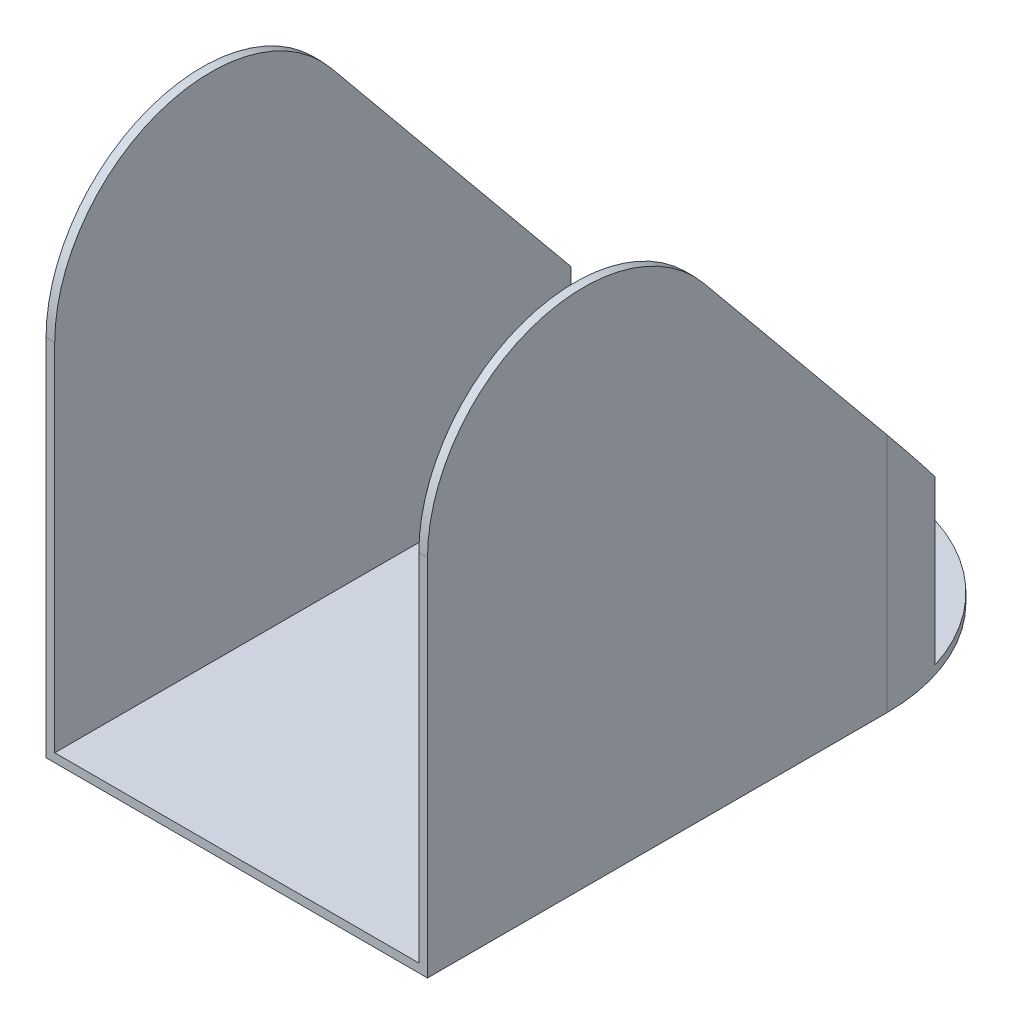
ISO-10303-21;
HEADER;
FILE_DESCRIPTION(('STEP AP214'),'2;1');
FILE_NAME('part.step','',(''),(''),'','','');
FILE_SCHEMA(('AUTOMOTIVE_DESIGN { 1 0 10303 214 1 1 1 1 }'));
ENDSEC;
DATA;
#1=APPLICATION_CONTEXT('core data for automotive mechanical design processes');
#2=APPLICATION_PROTOCOL_DEFINITION('international standard','automotive_design',2000,#1);
#3=PRODUCT_CONTEXT('',#1,'mechanical');
#4=PRODUCT('Part','Part','',(#3));
#5=PRODUCT_RELATED_PRODUCT_CATEGORY('part','',(#4));
#6=PRODUCT_DEFINITION_FORMATION('','',#4);
#7=PRODUCT_DEFINITION_CONTEXT('part definition',#1,'design');
#8=PRODUCT_DEFINITION('design','',#6,#7);
#9=PRODUCT_DEFINITION_SHAPE('','',#8);
#10=(LENGTH_UNIT() NAMED_UNIT(*) SI_UNIT(.MILLI.,.METRE.));
#11=(NAMED_UNIT(*) PLANE_ANGLE_UNIT() SI_UNIT($,.RADIAN.));
#12=(NAMED_UNIT(*) SI_UNIT($,.STERADIAN.) SOLID_ANGLE_UNIT());
#13=UNCERTAINTY_MEASURE_WITH_UNIT(LENGTH_MEASURE(1.E-05),#10,'distance_accuracy_value','');
#14=(GEOMETRIC_REPRESENTATION_CONTEXT(3) GLOBAL_UNCERTAINTY_ASSIGNED_CONTEXT((#13)) GLOBAL_UNIT_ASSIGNED_CONTEXT((#10,
#11,#12)) REPRESENTATION_CONTEXT('',''));
#15=CARTESIAN_POINT('',(0.,0.,0.));
#16=DIRECTION('',(0.,0.,1.));
#17=DIRECTION('',(1.,0.,0.));
#18=AXIS2_PLACEMENT_3D('',#15,#16,#17);
#19=CARTESIAN_POINT('',(-21.,-29.,75.));
#20=DIRECTION('',(0.,-1.,0.));
#21=DIRECTION('',(0.,0.,-1.));
#22=AXIS2_PLACEMENT_3D('',#19,#20,#21);
#23=PLANE('',#22);
#24=CARTESIAN_POINT('',(0.,-29.,22.));
#25=DIRECTION('',(0.,-1.,0.));
#26=DIRECTION('',(0.,0.,-1.));
#27=AXIS2_PLACEMENT_3D('',#24,#25,#26);
#28=CIRCLE('',#27,22.);
#29=CARTESIAN_POINT('',(-21.,-29.,15.442561475698));
#30=VERTEX_POINT('',#29);
#31=CARTESIAN_POINT('',(21.,-29.,15.442561475698));
#32=VERTEX_POINT('',#31);
#33=EDGE_CURVE('E255',#30,#32,#28,.T.);
#34=ORIENTED_EDGE('',*,*,#33,.F.);
#35=DIRECTION('',(0.,0.,-1.));
#36=VECTOR('',#35,1.);
#37=CARTESIAN_POINT('',(-21.,-29.,75.));
#38=LINE('',#37,#36);
#39=CARTESIAN_POINT('',(-21.,-29.,75.));
#40=VERTEX_POINT('',#39);
#41=EDGE_CURVE('E160',#40,#30,#38,.T.);
#42=ORIENTED_EDGE('',*,*,#41,.F.);
#43=DIRECTION('',(-1.,0.,0.));
#44=VECTOR('',#43,1.);
#45=CARTESIAN_POINT('',(-21.,-29.,75.));
#46=LINE('',#45,#44);
#47=CARTESIAN_POINT('',(21.,-29.,75.));
#48=VERTEX_POINT('',#47);
#49=EDGE_CURVE('E212',#48,#40,#46,.T.);
#50=ORIENTED_EDGE('',*,*,#49,.F.);
#51=DIRECTION('',(0.,0.,-1.));
#52=VECTOR('',#51,1.);
#53=CARTESIAN_POINT('',(21.,-29.,75.));
#54=LINE('',#53,#52);
#55=EDGE_CURVE('E166',#48,#32,#54,.T.);
#56=ORIENTED_EDGE('',*,*,#55,.T.);
#57=EDGE_LOOP('',(#34,#42,#50,#56));
#58=FACE_BOUND('',#57,.T.);
#59=ADVANCED_FACE('F59',(#58),#23,.F.);
#60=CARTESIAN_POINT('',(-22.,-30.,75.));
#61=DIRECTION('',(0.,1.,0.));
#62=DIRECTION('',(0.,0.,1.));
#63=AXIS2_PLACEMENT_3D('',#60,#61,#62);
#64=PLANE('',#63);
#65=DIRECTION('',(0.,0.,-1.));
#66=VECTOR('',#65,1.);
#67=CARTESIAN_POINT('',(-22.,-30.,75.));
#68=LINE('',#67,#66);
#69=CARTESIAN_POINT('',(-22.,-30.,75.));
#70=VERTEX_POINT('',#69);
#71=CARTESIAN_POINT('',(-22.,-30.,22.));
#72=VERTEX_POINT('',#71);
#73=EDGE_CURVE('E153',#70,#72,#68,.T.);
#74=ORIENTED_EDGE('',*,*,#73,.T.);
#75=CARTESIAN_POINT('',(0.,-30.,22.));
#76=DIRECTION('',(0.,-1.,0.));
#77=DIRECTION('',(0.,0.,-1.));
#78=AXIS2_PLACEMENT_3D('',#75,#76,#77);
#79=CIRCLE('',#78,22.);
#80=CARTESIAN_POINT('',(22.,-30.,22.));
#81=VERTEX_POINT('',#80);
#82=EDGE_CURVE('E136',#72,#81,#79,.T.);
#83=ORIENTED_EDGE('',*,*,#82,.T.);
#84=DIRECTION('',(0.,0.,-1.));
#85=VECTOR('',#84,1.);
#86=CARTESIAN_POINT('',(22.,-30.,75.));
#87=LINE('',#86,#85);
#88=CARTESIAN_POINT('',(22.,-30.,75.));
#89=VERTEX_POINT('',#88);
#90=EDGE_CURVE('E161',#89,#81,#87,.T.);
#91=ORIENTED_EDGE('',*,*,#90,.F.);
#92=DIRECTION('',(1.,0.,0.));
#93=VECTOR('',#92,1.);
#94=CARTESIAN_POINT('',(-22.,-30.,75.));
#95=LINE('',#94,#93);
#96=EDGE_CURVE('E83',#70,#89,#95,.T.);
#97=ORIENTED_EDGE('',*,*,#96,.F.);
#98=EDGE_LOOP('',(#74,#83,#91,#97));
#99=FACE_BOUND('',#98,.T.);
#100=ADVANCED_FACE('F158',(#99),#64,.F.);
#101=CARTESIAN_POINT('',(-21.,30.,75.));
#102=DIRECTION('',(-1.,0.,0.));
#103=DIRECTION('',(0.,-1.,0.));
#104=AXIS2_PLACEMENT_3D('',#101,#102,#103);
#105=PLANE('',#104);
#106=DIRECTION('',(0.,-1.,0.));
#107=VECTOR('',#106,1.);
#108=CARTESIAN_POINT('',(-21.,30.,15.442561475698));
#109=LINE('',#108,#107);
#110=CARTESIAN_POINT('',(-21.,-10.2122612272496,15.442561475698));
#111=VERTEX_POINT('',#110);
#112=EDGE_CURVE('E146',#111,#30,#109,.T.);
#113=ORIENTED_EDGE('',*,*,#112,.F.);
#114=DIRECTION('',(0.,-0.772529054392895,-0.634979417082805));
#115=VECTOR('',#114,1.);
#116=CARTESIAN_POINT('',(-21.,43.0017709008345,59.1817773785494));
#117=LINE('',#116,#115);
#118=CARTESIAN_POINT('',(-21.,23.4296295074905,43.0944770209279));
#119=VERTEX_POINT('',#118);
#120=EDGE_CURVE('E194',#119,#111,#117,.T.);
#121=ORIENTED_EDGE('',*,*,#120,.F.);
#122=CARTESIAN_POINT('',(-21.,12.,57.));
#123=DIRECTION('',(-1.,0.,0.));
#124=DIRECTION('',(0.,-1.,0.));
#125=AXIS2_PLACEMENT_3D('',#122,#123,#124);
#126=CIRCLE('',#125,18.);
#127=CARTESIAN_POINT('',(-21.,12.,75.));
#128=VERTEX_POINT('',#127);
#129=EDGE_CURVE('E193',#128,#119,#126,.T.);
#130=ORIENTED_EDGE('',*,*,#129,.F.);
#131=DIRECTION('',(0.,1.,0.));
#132=VECTOR('',#131,1.);
#133=CARTESIAN_POINT('',(-21.,30.,75.));
#134=LINE('',#133,#132);
#135=EDGE_CURVE('E215',#40,#128,#134,.T.);
#136=ORIENTED_EDGE('',*,*,#135,.F.);
#137=ORIENTED_EDGE('',*,*,#41,.T.);
#138=EDGE_LOOP('',(#113,#121,#130,#136,#137));
#139=FACE_BOUND('',#138,.T.);
#140=ADVANCED_FACE('F267',(#139),#105,.F.);
#141=CARTESIAN_POINT('',(-104.036577207975,-11.6927669434458,14.2256614105));
#142=DIRECTION('',(0.,0.634979417082805,-0.772529054392895));
#143=DIRECTION('',(0.,0.772529054392895,0.634979417082805));
#144=AXIS2_PLACEMENT_3D('',#141,#142,#143);
#145=PLANE('',#144);
#146=ORIENTED_EDGE('',*,*,#120,.T.);
#147=CARTESIAN_POINT('',(0.,-2.23434628050732,22.));
#148=DIRECTION('',(0.,0.634979417082805,-0.772529054392895));
#149=DIRECTION('',(0.,-0.772529054392895,-0.634979417082805));
#150=AXIS2_PLACEMENT_3D('',#147,#148,#149);
#151=ELLIPSE('',#150,34.6467923339491,22.);
#152=CARTESIAN_POINT('',(-22.,-2.23434628050733,22.));
#153=VERTEX_POINT('',#152);
#154=EDGE_CURVE('E12',#111,#153,#151,.T.);
#155=ORIENTED_EDGE('',*,*,#154,.T.);
#156=DIRECTION('',(0.,-0.772529054392895,-0.634979417082805));
#157=VECTOR('',#156,1.);
#158=CARTESIAN_POINT('',(-22.,-11.6927669434458,14.2256614105));
#159=LINE('',#158,#157);
#160=CARTESIAN_POINT('',(-22.,23.4296295074905,43.0944770209279));
#161=VERTEX_POINT('',#160);
#162=EDGE_CURVE('E155',#161,#153,#159,.T.);
#163=ORIENTED_EDGE('',*,*,#162,.F.);
#164=DIRECTION('',(1.,0.,0.));
#165=VECTOR('',#164,1.);
#166=CARTESIAN_POINT('',(-104.036577207975,23.4296295074905,43.0944770209279));
#167=LINE('',#166,#165);
#168=EDGE_CURVE('E231',#161,#119,#167,.T.);
#169=ORIENTED_EDGE('',*,*,#168,.T.);
#170=EDGE_LOOP('',(#146,#155,#163,#169));
#171=FACE_BOUND('',#170,.T.);
#172=ADVANCED_FACE('F268',(#171),#145,.T.);
#173=CARTESIAN_POINT('',(22.,30.,75.));
#174=DIRECTION('',(-1.,0.,0.));
#175=DIRECTION('',(0.,-1.,0.));
#176=AXIS2_PLACEMENT_3D('',#173,#174,#175);
#177=PLANE('',#176);
#178=DIRECTION('',(0.,-1.,0.));
#179=VECTOR('',#178,1.);
#180=CARTESIAN_POINT('',(22.,30.,22.));
#181=LINE('',#180,#179);
#182=CARTESIAN_POINT('',(22.,-2.23434628050733,22.));
#183=VERTEX_POINT('',#182);
#184=EDGE_CURVE('E141',#183,#81,#181,.T.);
#185=ORIENTED_EDGE('',*,*,#184,.F.);
#186=DIRECTION('',(0.,0.772529054392895,0.634979417082805));
#187=VECTOR('',#186,1.);
#188=CARTESIAN_POINT('',(22.,-11.6927669434458,14.2256614105));
#189=LINE('',#188,#187);
#190=CARTESIAN_POINT('',(22.,23.4296295074905,43.0944770209279));
#191=VERTEX_POINT('',#190);
#192=EDGE_CURVE('E185',#183,#191,#189,.T.);
#193=ORIENTED_EDGE('',*,*,#192,.T.);
#194=CARTESIAN_POINT('',(22.,12.,57.));
#195=DIRECTION('',(1.,0.,0.));
#196=DIRECTION('',(0.,0.,-1.));
#197=AXIS2_PLACEMENT_3D('',#194,#195,#196);
#198=CIRCLE('',#197,18.);
#199=CARTESIAN_POINT('',(22.,12.,75.));
#200=VERTEX_POINT('',#199);
#201=EDGE_CURVE('E235',#191,#200,#198,.T.);
#202=ORIENTED_EDGE('',*,*,#201,.T.);
#203=DIRECTION('',(0.,1.,0.));
#204=VECTOR('',#203,1.);
#205=CARTESIAN_POINT('',(22.,30.,75.));
#206=LINE('',#205,#204);
#207=EDGE_CURVE('E206',#89,#200,#206,.T.);
#208=ORIENTED_EDGE('',*,*,#207,.F.);
#209=ORIENTED_EDGE('',*,*,#90,.T.);
#210=EDGE_LOOP('',(#185,#193,#202,#208,#209));
#211=FACE_BOUND('',#210,.T.);
#212=ADVANCED_FACE('F61',(#211),#177,.F.);
#213=CARTESIAN_POINT('',(21.,30.,75.));
#214=DIRECTION('',(1.,0.,0.));
#215=DIRECTION('',(0.,1.,0.));
#216=AXIS2_PLACEMENT_3D('',#213,#214,#215);
#217=PLANE('',#216);
#218=DIRECTION('',(0.,-1.,0.));
#219=VECTOR('',#218,1.);
#220=CARTESIAN_POINT('',(21.,30.,15.442561475698));
#221=LINE('',#220,#219);
#222=CARTESIAN_POINT('',(21.,-10.2122612272495,15.442561475698));
#223=VERTEX_POINT('',#222);
#224=EDGE_CURVE('E75',#32,#223,#221,.F.);
#225=ORIENTED_EDGE('',*,*,#224,.F.);
#226=ORIENTED_EDGE('',*,*,#55,.F.);
#227=DIRECTION('',(0.,-1.,0.));
#228=VECTOR('',#227,1.);
#229=CARTESIAN_POINT('',(21.,30.,75.));
#230=LINE('',#229,#228);
#231=CARTESIAN_POINT('',(21.,12.,75.));
#232=VERTEX_POINT('',#231);
#233=EDGE_CURVE('E209',#232,#48,#230,.T.);
#234=ORIENTED_EDGE('',*,*,#233,.F.);
#235=CARTESIAN_POINT('',(21.,12.,57.));
#236=DIRECTION('',(1.,0.,0.));
#237=DIRECTION('',(0.,1.,0.));
#238=AXIS2_PLACEMENT_3D('',#235,#236,#237);
#239=CIRCLE('',#238,18.);
#240=CARTESIAN_POINT('',(21.,23.4296295074905,43.0944770209279));
#241=VERTEX_POINT('',#240);
#242=EDGE_CURVE('E191',#241,#232,#239,.T.);
#243=ORIENTED_EDGE('',*,*,#242,.F.);
#244=DIRECTION('',(0.,0.772529054392895,0.634979417082805));
#245=VECTOR('',#244,1.);
#246=CARTESIAN_POINT('',(21.,43.0017709008345,59.1817773785494));
#247=LINE('',#246,#245);
#248=EDGE_CURVE('E183',#223,#241,#247,.T.);
#249=ORIENTED_EDGE('',*,*,#248,.F.);
#250=EDGE_LOOP('',(#225,#226,#234,#243,#249));
#251=FACE_BOUND('',#250,.T.);
#252=ADVANCED_FACE('F188',(#251),#217,.F.);
#253=ORIENTED_EDGE('',*,*,#192,.F.);
#254=CARTESIAN_POINT('',(0.,-2.23434628050732,22.));
#255=DIRECTION('',(0.,0.634979417082805,-0.772529054392895));
#256=DIRECTION('',(0.,-0.772529054392895,-0.634979417082805));
#257=AXIS2_PLACEMENT_3D('',#254,#255,#256);
#258=ELLIPSE('',#257,34.6467923339491,22.);
#259=EDGE_CURVE('E68',#183,#223,#258,.T.);
#260=ORIENTED_EDGE('',*,*,#259,.T.);
#261=ORIENTED_EDGE('',*,*,#248,.T.);
#262=EDGE_CURVE('E240',#241,#191,#167,.T.);
#263=ORIENTED_EDGE('',*,*,#262,.T.);
#264=EDGE_LOOP('',(#253,#260,#261,#263));
#265=FACE_BOUND('',#264,.T.);
#266=ADVANCED_FACE('F181',(#265),#145,.T.);
#267=CARTESIAN_POINT('',(-22.,30.,75.));
#268=DIRECTION('',(1.,0.,0.));
#269=DIRECTION('',(0.,1.,0.));
#270=AXIS2_PLACEMENT_3D('',#267,#268,#269);
#271=PLANE('',#270);
#272=ORIENTED_EDGE('',*,*,#162,.T.);
#273=DIRECTION('',(0.,-1.,0.));
#274=VECTOR('',#273,1.);
#275=CARTESIAN_POINT('',(-22.,30.,22.));
#276=LINE('',#275,#274);
#277=EDGE_CURVE('E139',#153,#72,#276,.T.);
#278=ORIENTED_EDGE('',*,*,#277,.T.);
#279=ORIENTED_EDGE('',*,*,#73,.F.);
#280=DIRECTION('',(0.,-1.,0.));
#281=VECTOR('',#280,1.);
#282=CARTESIAN_POINT('',(-22.,30.,75.));
#283=LINE('',#282,#281);
#284=CARTESIAN_POINT('',(-22.,12.,75.));
#285=VERTEX_POINT('',#284);
#286=EDGE_CURVE('E219',#285,#70,#283,.T.);
#287=ORIENTED_EDGE('',*,*,#286,.F.);
#288=CARTESIAN_POINT('',(-22.,12.,57.));
#289=DIRECTION('',(1.,0.,0.));
#290=DIRECTION('',(0.,1.,0.));
#291=AXIS2_PLACEMENT_3D('',#288,#289,#290);
#292=CIRCLE('',#291,18.);
#293=EDGE_CURVE('E200',#285,#161,#292,.F.);
#294=ORIENTED_EDGE('',*,*,#293,.T.);
#295=EDGE_LOOP('',(#272,#278,#279,#287,#294));
#296=FACE_BOUND('',#295,.T.);
#297=ADVANCED_FACE('F151',(#296),#271,.F.);
#298=CARTESIAN_POINT('',(0.,0.,75.));
#299=DIRECTION('',(0.,0.,1.));
#300=DIRECTION('',(1.,0.,0.));
#301=AXIS2_PLACEMENT_3D('',#298,#299,#300);
#302=PLANE('',#301);
#303=DIRECTION('',(1.,0.,0.));
#304=VECTOR('',#303,1.);
#305=CARTESIAN_POINT('',(-104.036577207975,12.,75.));
#306=LINE('',#305,#304);
#307=EDGE_CURVE('E225',#285,#128,#306,.T.);
#308=ORIENTED_EDGE('',*,*,#307,.F.);
#309=ORIENTED_EDGE('',*,*,#286,.T.);
#310=ORIENTED_EDGE('',*,*,#96,.T.);
#311=ORIENTED_EDGE('',*,*,#207,.T.);
#312=DIRECTION('',(1.,0.,0.));
#313=VECTOR('',#312,1.);
#314=CARTESIAN_POINT('',(-104.036577207975,12.,75.));
#315=LINE('',#314,#313);
#316=EDGE_CURVE('E174',#232,#200,#315,.T.);
#317=ORIENTED_EDGE('',*,*,#316,.F.);
#318=ORIENTED_EDGE('',*,*,#233,.T.);
#319=ORIENTED_EDGE('',*,*,#49,.T.);
#320=ORIENTED_EDGE('',*,*,#135,.T.);
#321=EDGE_LOOP('',(#308,#309,#310,#311,#317,#318,#319,#320));
#322=FACE_BOUND('',#321,.T.);
#323=ADVANCED_FACE('F223',(#322),#302,.T.);
#324=CARTESIAN_POINT('',(-104.036577207975,12.,57.));
#325=DIRECTION('',(1.,0.,0.));
#326=DIRECTION('',(0.,0.,-1.));
#327=AXIS2_PLACEMENT_3D('',#324,#325,#326);
#328=CYLINDRICAL_SURFACE('',#327,18.);
#329=ORIENTED_EDGE('',*,*,#129,.T.);
#330=ORIENTED_EDGE('',*,*,#168,.F.);
#331=ORIENTED_EDGE('',*,*,#293,.F.);
#332=ORIENTED_EDGE('',*,*,#307,.T.);
#333=EDGE_LOOP('',(#329,#330,#331,#332));
#334=FACE_BOUND('',#333,.T.);
#335=ADVANCED_FACE('F261',(#334),#328,.T.);
#336=ORIENTED_EDGE('',*,*,#242,.T.);
#337=ORIENTED_EDGE('',*,*,#316,.T.);
#338=ORIENTED_EDGE('',*,*,#201,.F.);
#339=ORIENTED_EDGE('',*,*,#262,.F.);
#340=EDGE_LOOP('',(#336,#337,#338,#339));
#341=FACE_BOUND('',#340,.T.);
#342=ADVANCED_FACE('F248',(#341),#328,.T.);
#343=CARTESIAN_POINT('',(0.,30.,22.));
#344=DIRECTION('',(0.,-1.,0.));
#345=DIRECTION('',(0.,0.,-1.));
#346=AXIS2_PLACEMENT_3D('',#343,#344,#345);
#347=CYLINDRICAL_SURFACE('',#346,22.);
#348=ORIENTED_EDGE('',*,*,#33,.T.);
#349=ORIENTED_EDGE('',*,*,#224,.T.);
#350=ORIENTED_EDGE('',*,*,#259,.F.);
#351=ORIENTED_EDGE('',*,*,#184,.T.);
#352=ORIENTED_EDGE('',*,*,#82,.F.);
#353=ORIENTED_EDGE('',*,*,#277,.F.);
#354=ORIENTED_EDGE('',*,*,#154,.F.);
#355=ORIENTED_EDGE('',*,*,#112,.T.);
#356=EDGE_LOOP('',(#348,#349,#350,#351,#352,#353,#354,#355));
#357=FACE_BOUND('',#356,.T.);
#358=ADVANCED_FACE('F138',(#357),#347,.T.);
#359=CLOSED_SHELL('',(#59,#100,#140,#172,#212,#252,#266,#297,#323,#335,#342,#358));
#360=MANIFOLD_SOLID_BREP('B2',#359);
#361=ADVANCED_BREP_SHAPE_REPRESENTATION('',(#18,#360),#14);
#362=SHAPE_DEFINITION_REPRESENTATION(#9,#361);
ENDSEC;
END-ISO-10303-21;
